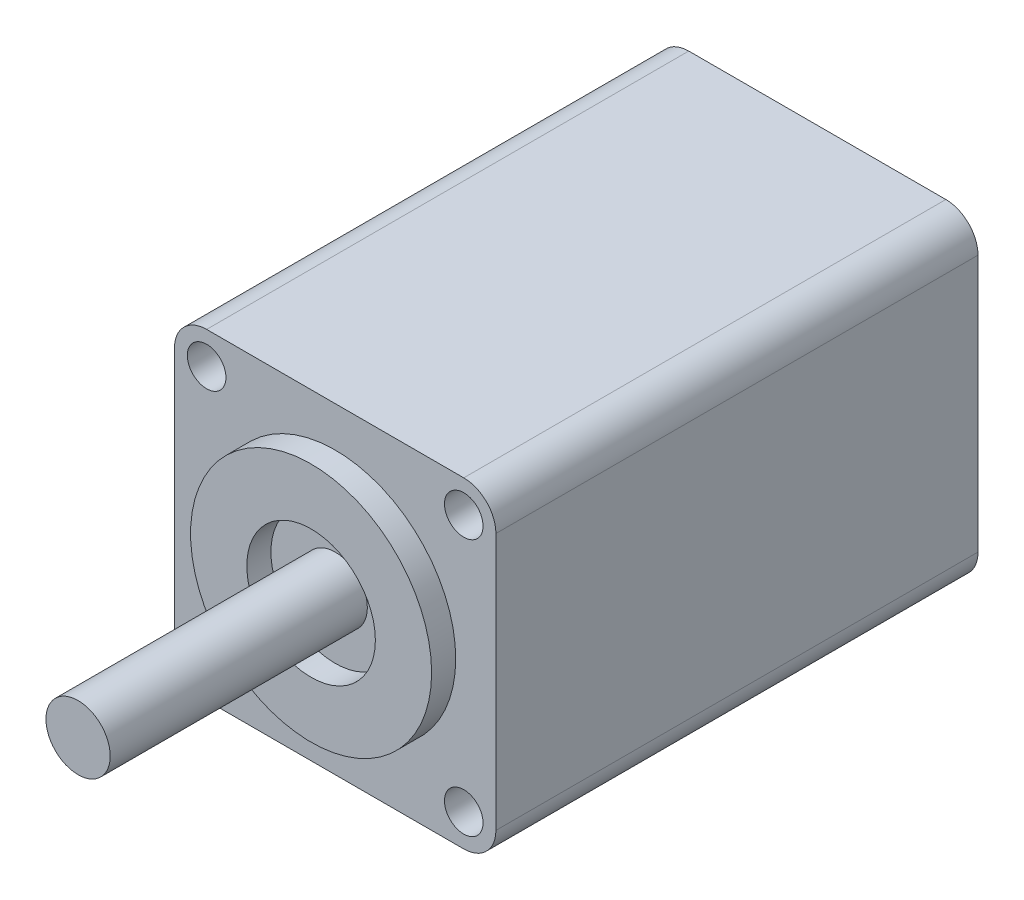
ISO-10303-21;
HEADER;
FILE_DESCRIPTION(('STEP AP214'),'2;1');
FILE_NAME('part.step','',(''),(''),'','','');
FILE_SCHEMA(('AUTOMOTIVE_DESIGN { 1 0 10303 214 1 1 1 1 }'));
ENDSEC;
DATA;
#1=APPLICATION_CONTEXT('core data for automotive mechanical design processes');
#2=APPLICATION_PROTOCOL_DEFINITION('international standard','automotive_design',2000,#1);
#3=PRODUCT_CONTEXT('',#1,'mechanical');
#4=PRODUCT('Part','Part','',(#3));
#5=PRODUCT_RELATED_PRODUCT_CATEGORY('part','',(#4));
#6=PRODUCT_DEFINITION_FORMATION('','',#4);
#7=PRODUCT_DEFINITION_CONTEXT('part definition',#1,'design');
#8=PRODUCT_DEFINITION('design','',#6,#7);
#9=PRODUCT_DEFINITION_SHAPE('','',#8);
#10=(LENGTH_UNIT() NAMED_UNIT(*) SI_UNIT(.MILLI.,.METRE.));
#11=(NAMED_UNIT(*) PLANE_ANGLE_UNIT() SI_UNIT($,.RADIAN.));
#12=(NAMED_UNIT(*) SI_UNIT($,.STERADIAN.) SOLID_ANGLE_UNIT());
#13=UNCERTAINTY_MEASURE_WITH_UNIT(LENGTH_MEASURE(1.E-05),#10,'distance_accuracy_value','');
#14=(GEOMETRIC_REPRESENTATION_CONTEXT(3) GLOBAL_UNCERTAINTY_ASSIGNED_CONTEXT((#13)) GLOBAL_UNIT_ASSIGNED_CONTEXT((#10,
#11,#12)) REPRESENTATION_CONTEXT('',''));
#15=CARTESIAN_POINT('',(0.,0.,0.));
#16=DIRECTION('',(0.,0.,1.));
#17=DIRECTION('',(1.,0.,0.));
#18=AXIS2_PLACEMENT_3D('',#15,#16,#17);
#19=CARTESIAN_POINT('',(-8.,-8.00000000000001,0.));
#20=DIRECTION('',(0.,0.,1.));
#21=DIRECTION('',(1.,0.,0.));
#22=AXIS2_PLACEMENT_3D('',#19,#20,#21);
#23=PLANE('',#22);
#24=CARTESIAN_POINT('',(0.,0.,0.));
#25=DIRECTION('',(0.,0.,1.));
#26=DIRECTION('',(1.,0.,0.));
#27=AXIS2_PLACEMENT_3D('',#24,#25,#26);
#28=CIRCLE('',#27,4.);
#29=CARTESIAN_POINT('',(4.,0.,0.));
#30=VERTEX_POINT('',#29);
#31=EDGE_CURVE('E11',#30,#30,#28,.F.);
#32=ORIENTED_EDGE('',*,*,#31,.F.);
#33=EDGE_LOOP('',(#32));
#34=FACE_BOUND('',#33,.T.);
#35=CARTESIAN_POINT('',(0.,0.,0.));
#36=DIRECTION('',(0.,0.,1.));
#37=DIRECTION('',(1.,0.,0.));
#38=AXIS2_PLACEMENT_3D('',#35,#36,#37);
#39=CIRCLE('',#38,2.);
#40=CARTESIAN_POINT('',(2.,0.,0.));
#41=VERTEX_POINT('',#40);
#42=EDGE_CURVE('E271',#41,#41,#39,.T.);
#43=ORIENTED_EDGE('',*,*,#42,.F.);
#44=EDGE_LOOP('',(#43));
#45=FACE_BOUND('',#44,.T.);
#46=ADVANCED_FACE('F32',(#34,#45),#23,.T.);
#47=CARTESIAN_POINT('',(-8.,8.,0.));
#48=DIRECTION('',(0.,0.,1.));
#49=DIRECTION('',(1.,0.,0.));
#50=AXIS2_PLACEMENT_3D('',#47,#48,#49);
#51=CIRCLE('',#50,1.2);
#52=CARTESIAN_POINT('',(-6.8,8.,0.));
#53=VERTEX_POINT('',#52);
#54=EDGE_CURVE('E249',#53,#53,#51,.T.);
#55=ORIENTED_EDGE('',*,*,#54,.F.);
#56=EDGE_LOOP('',(#55));
#57=FACE_BOUND('',#56,.T.);
#58=CARTESIAN_POINT('',(8.,8.,0.));
#59=DIRECTION('',(0.,0.,1.));
#60=DIRECTION('',(1.,0.,0.));
#61=AXIS2_PLACEMENT_3D('',#58,#59,#60);
#62=CIRCLE('',#61,1.2);
#63=CARTESIAN_POINT('',(9.2,8.,0.));
#64=VERTEX_POINT('',#63);
#65=EDGE_CURVE('E251',#64,#64,#62,.T.);
#66=ORIENTED_EDGE('',*,*,#65,.F.);
#67=EDGE_LOOP('',(#66));
#68=FACE_BOUND('',#67,.T.);
#69=CARTESIAN_POINT('',(8.,-8.,0.));
#70=DIRECTION('',(0.,0.,1.));
#71=DIRECTION('',(1.,0.,0.));
#72=AXIS2_PLACEMENT_3D('',#69,#70,#71);
#73=CIRCLE('',#72,1.2);
#74=CARTESIAN_POINT('',(9.2,-8.,0.));
#75=VERTEX_POINT('',#74);
#76=EDGE_CURVE('E259',#75,#75,#73,.T.);
#77=ORIENTED_EDGE('',*,*,#76,.F.);
#78=EDGE_LOOP('',(#77));
#79=FACE_BOUND('',#78,.T.);
#80=CARTESIAN_POINT('',(-8.,-8.,0.));
#81=DIRECTION('',(0.,0.,1.));
#82=DIRECTION('',(1.,0.,0.));
#83=AXIS2_PLACEMENT_3D('',#80,#81,#82);
#84=CIRCLE('',#83,1.2);
#85=CARTESIAN_POINT('',(-6.8,-8.,0.));
#86=VERTEX_POINT('',#85);
#87=EDGE_CURVE('E265',#86,#86,#84,.T.);
#88=ORIENTED_EDGE('',*,*,#87,.F.);
#89=EDGE_LOOP('',(#88));
#90=FACE_BOUND('',#89,.T.);
#91=CARTESIAN_POINT('',(-8.,-8.00000000000001,0.));
#92=DIRECTION('',(0.,0.,1.));
#93=DIRECTION('',(1.,0.,0.));
#94=AXIS2_PLACEMENT_3D('',#91,#92,#93);
#95=CIRCLE('',#94,2.);
#96=CARTESIAN_POINT('',(-10.,-8.00000000000001,0.));
#97=VERTEX_POINT('',#96);
#98=CARTESIAN_POINT('',(-8.,-10.,0.));
#99=VERTEX_POINT('',#98);
#100=EDGE_CURVE('E134',#97,#99,#95,.T.);
#101=ORIENTED_EDGE('',*,*,#100,.T.);
#102=DIRECTION('',(1.,0.,0.));
#103=VECTOR('',#102,1.);
#104=CARTESIAN_POINT('',(-8.,-10.,0.));
#105=LINE('',#104,#103);
#106=CARTESIAN_POINT('',(8.,-10.,0.));
#107=VERTEX_POINT('',#106);
#108=EDGE_CURVE('E137',#99,#107,#105,.T.);
#109=ORIENTED_EDGE('',*,*,#108,.T.);
#110=CARTESIAN_POINT('',(8.,-8.00000000000001,0.));
#111=DIRECTION('',(0.,0.,1.));
#112=DIRECTION('',(1.,0.,0.));
#113=AXIS2_PLACEMENT_3D('',#110,#111,#112);
#114=CIRCLE('',#113,2.);
#115=CARTESIAN_POINT('',(10.,-8.00000000000001,0.));
#116=VERTEX_POINT('',#115);
#117=EDGE_CURVE('E141',#107,#116,#114,.T.);
#118=ORIENTED_EDGE('',*,*,#117,.T.);
#119=DIRECTION('',(0.,1.,0.));
#120=VECTOR('',#119,1.);
#121=CARTESIAN_POINT('',(10.,-8.00000000000001,0.));
#122=LINE('',#121,#120);
#123=CARTESIAN_POINT('',(10.,7.99999999999999,0.));
#124=VERTEX_POINT('',#123);
#125=EDGE_CURVE('E144',#116,#124,#122,.T.);
#126=ORIENTED_EDGE('',*,*,#125,.T.);
#127=CARTESIAN_POINT('',(8.,7.99999999999999,0.));
#128=DIRECTION('',(0.,0.,1.));
#129=DIRECTION('',(-1.,0.,0.));
#130=AXIS2_PLACEMENT_3D('',#127,#128,#129);
#131=CIRCLE('',#130,2.);
#132=CARTESIAN_POINT('',(8.,9.99999999999999,0.));
#133=VERTEX_POINT('',#132);
#134=EDGE_CURVE('E147',#124,#133,#131,.T.);
#135=ORIENTED_EDGE('',*,*,#134,.T.);
#136=DIRECTION('',(-1.,0.,0.));
#137=VECTOR('',#136,1.);
#138=CARTESIAN_POINT('',(-8.,9.99999999999999,0.));
#139=LINE('',#138,#137);
#140=CARTESIAN_POINT('',(-8.,9.99999999999999,0.));
#141=VERTEX_POINT('',#140);
#142=EDGE_CURVE('E150',#133,#141,#139,.T.);
#143=ORIENTED_EDGE('',*,*,#142,.T.);
#144=CARTESIAN_POINT('',(-8.,7.99999999999999,0.));
#145=DIRECTION('',(0.,0.,1.));
#146=DIRECTION('',(1.,0.,0.));
#147=AXIS2_PLACEMENT_3D('',#144,#145,#146);
#148=CIRCLE('',#147,2.);
#149=CARTESIAN_POINT('',(-10.,7.99999999999999,0.));
#150=VERTEX_POINT('',#149);
#151=EDGE_CURVE('E111',#141,#150,#148,.T.);
#152=ORIENTED_EDGE('',*,*,#151,.T.);
#153=DIRECTION('',(0.,-1.,0.));
#154=VECTOR('',#153,1.);
#155=CARTESIAN_POINT('',(-10.,-8.00000000000001,0.));
#156=LINE('',#155,#154);
#157=EDGE_CURVE('E153',#150,#97,#156,.T.);
#158=ORIENTED_EDGE('',*,*,#157,.T.);
#159=EDGE_LOOP('',(#101,#109,#118,#126,#135,#143,#152,#158));
#160=FACE_BOUND('',#159,.T.);
#161=CARTESIAN_POINT('',(0.,0.,0.));
#162=DIRECTION('',(0.,0.,1.));
#163=DIRECTION('',(1.,0.,0.));
#164=AXIS2_PLACEMENT_3D('',#161,#162,#163);
#165=CIRCLE('',#164,7.5);
#166=CARTESIAN_POINT('',(7.5,0.,0.));
#167=VERTEX_POINT('',#166);
#168=EDGE_CURVE('E280',#167,#167,#165,.T.);
#169=ORIENTED_EDGE('',*,*,#168,.F.);
#170=EDGE_LOOP('',(#169));
#171=FACE_BOUND('',#170,.T.);
#172=ADVANCED_FACE('F168',(#57,#68,#79,#90,#160,#171),#23,.T.);
#173=CARTESIAN_POINT('',(-8.,-8.00000000000001,-30.));
#174=DIRECTION('',(0.,0.,1.));
#175=DIRECTION('',(1.,0.,0.));
#176=AXIS2_PLACEMENT_3D('',#173,#174,#175);
#177=CYLINDRICAL_SURFACE('',#176,2.);
#178=ORIENTED_EDGE('',*,*,#100,.F.);
#179=DIRECTION('',(0.,0.,1.));
#180=VECTOR('',#179,1.);
#181=CARTESIAN_POINT('',(-10.,-8.00000000000001,-30.));
#182=LINE('',#181,#180);
#183=CARTESIAN_POINT('',(-10.,-8.00000000000001,-30.));
#184=VERTEX_POINT('',#183);
#185=EDGE_CURVE('E41',#184,#97,#182,.T.);
#186=ORIENTED_EDGE('',*,*,#185,.F.);
#187=CARTESIAN_POINT('',(-8.,-8.00000000000001,-30.));
#188=DIRECTION('',(0.,0.,1.));
#189=DIRECTION('',(1.,0.,0.));
#190=AXIS2_PLACEMENT_3D('',#187,#188,#189);
#191=CIRCLE('',#190,2.);
#192=CARTESIAN_POINT('',(-8.,-10.,-30.));
#193=VERTEX_POINT('',#192);
#194=EDGE_CURVE('E156',#184,#193,#191,.T.);
#195=ORIENTED_EDGE('',*,*,#194,.T.);
#196=DIRECTION('',(0.,0.,1.));
#197=VECTOR('',#196,1.);
#198=CARTESIAN_POINT('',(-8.,-10.,-30.));
#199=LINE('',#198,#197);
#200=EDGE_CURVE('E90',#193,#99,#199,.T.);
#201=ORIENTED_EDGE('',*,*,#200,.T.);
#202=EDGE_LOOP('',(#178,#186,#195,#201));
#203=FACE_BOUND('',#202,.T.);
#204=ADVANCED_FACE('F34',(#203),#177,.T.);
#205=CARTESIAN_POINT('',(-10.,-8.00000000000001,-30.));
#206=DIRECTION('',(-1.,0.,0.));
#207=DIRECTION('',(0.,0.,1.));
#208=AXIS2_PLACEMENT_3D('',#205,#206,#207);
#209=PLANE('',#208);
#210=ORIENTED_EDGE('',*,*,#157,.F.);
#211=DIRECTION('',(0.,0.,1.));
#212=VECTOR('',#211,1.);
#213=CARTESIAN_POINT('',(-10.,7.99999999999999,-30.));
#214=LINE('',#213,#212);
#215=CARTESIAN_POINT('',(-10.,7.99999999999999,-30.));
#216=VERTEX_POINT('',#215);
#217=EDGE_CURVE('E78',#216,#150,#214,.T.);
#218=ORIENTED_EDGE('',*,*,#217,.F.);
#219=DIRECTION('',(0.,-1.,0.));
#220=VECTOR('',#219,1.);
#221=CARTESIAN_POINT('',(-10.,-8.00000000000001,-30.));
#222=LINE('',#221,#220);
#223=EDGE_CURVE('E124',#216,#184,#222,.T.);
#224=ORIENTED_EDGE('',*,*,#223,.T.);
#225=ORIENTED_EDGE('',*,*,#185,.T.);
#226=EDGE_LOOP('',(#210,#218,#224,#225));
#227=FACE_BOUND('',#226,.T.);
#228=ADVANCED_FACE('F170',(#227),#209,.T.);
#229=CARTESIAN_POINT('',(-8.,7.99999999999999,-30.));
#230=DIRECTION('',(0.,0.,1.));
#231=DIRECTION('',(1.,0.,0.));
#232=AXIS2_PLACEMENT_3D('',#229,#230,#231);
#233=CYLINDRICAL_SURFACE('',#232,2.);
#234=ORIENTED_EDGE('',*,*,#151,.F.);
#235=DIRECTION('',(0.,0.,1.));
#236=VECTOR('',#235,1.);
#237=CARTESIAN_POINT('',(-8.,9.99999999999999,-30.));
#238=LINE('',#237,#236);
#239=CARTESIAN_POINT('',(-8.,9.99999999999999,-30.));
#240=VERTEX_POINT('',#239);
#241=EDGE_CURVE('E106',#240,#141,#238,.T.);
#242=ORIENTED_EDGE('',*,*,#241,.F.);
#243=CARTESIAN_POINT('',(-8.,7.99999999999999,-30.));
#244=DIRECTION('',(0.,0.,1.));
#245=DIRECTION('',(1.,0.,0.));
#246=AXIS2_PLACEMENT_3D('',#243,#244,#245);
#247=CIRCLE('',#246,2.);
#248=EDGE_CURVE('E109',#240,#216,#247,.T.);
#249=ORIENTED_EDGE('',*,*,#248,.T.);
#250=ORIENTED_EDGE('',*,*,#217,.T.);
#251=EDGE_LOOP('',(#234,#242,#249,#250));
#252=FACE_BOUND('',#251,.T.);
#253=ADVANCED_FACE('F108',(#252),#233,.T.);
#254=CARTESIAN_POINT('',(-8.,9.99999999999999,-30.));
#255=DIRECTION('',(0.,1.,0.));
#256=DIRECTION('',(0.,0.,1.));
#257=AXIS2_PLACEMENT_3D('',#254,#255,#256);
#258=PLANE('',#257);
#259=ORIENTED_EDGE('',*,*,#142,.F.);
#260=DIRECTION('',(0.,0.,1.));
#261=VECTOR('',#260,1.);
#262=CARTESIAN_POINT('',(8.,9.99999999999999,-30.));
#263=LINE('',#262,#261);
#264=CARTESIAN_POINT('',(8.,9.99999999999999,-30.));
#265=VERTEX_POINT('',#264);
#266=EDGE_CURVE('E116',#265,#133,#263,.T.);
#267=ORIENTED_EDGE('',*,*,#266,.F.);
#268=DIRECTION('',(-1.,0.,0.));
#269=VECTOR('',#268,1.);
#270=CARTESIAN_POINT('',(-8.,9.99999999999999,-30.));
#271=LINE('',#270,#269);
#272=EDGE_CURVE('E122',#265,#240,#271,.T.);
#273=ORIENTED_EDGE('',*,*,#272,.T.);
#274=ORIENTED_EDGE('',*,*,#241,.T.);
#275=EDGE_LOOP('',(#259,#267,#273,#274));
#276=FACE_BOUND('',#275,.T.);
#277=ADVANCED_FACE('F126',(#276),#258,.T.);
#278=CARTESIAN_POINT('',(8.,7.99999999999999,-30.));
#279=DIRECTION('',(0.,0.,1.));
#280=DIRECTION('',(1.,0.,0.));
#281=AXIS2_PLACEMENT_3D('',#278,#279,#280);
#282=CYLINDRICAL_SURFACE('',#281,2.);
#283=ORIENTED_EDGE('',*,*,#134,.F.);
#284=DIRECTION('',(0.,0.,1.));
#285=VECTOR('',#284,1.);
#286=CARTESIAN_POINT('',(10.,7.99999999999999,-30.));
#287=LINE('',#286,#285);
#288=CARTESIAN_POINT('',(10.,7.99999999999999,-30.));
#289=VERTEX_POINT('',#288);
#290=EDGE_CURVE('E160',#289,#124,#287,.T.);
#291=ORIENTED_EDGE('',*,*,#290,.F.);
#292=CARTESIAN_POINT('',(8.,7.99999999999999,-30.));
#293=DIRECTION('',(0.,0.,1.));
#294=DIRECTION('',(-1.,0.,0.));
#295=AXIS2_PLACEMENT_3D('',#292,#293,#294);
#296=CIRCLE('',#295,2.);
#297=EDGE_CURVE('E127',#289,#265,#296,.T.);
#298=ORIENTED_EDGE('',*,*,#297,.T.);
#299=ORIENTED_EDGE('',*,*,#266,.T.);
#300=EDGE_LOOP('',(#283,#291,#298,#299));
#301=FACE_BOUND('',#300,.T.);
#302=ADVANCED_FACE('F300',(#301),#282,.T.);
#303=CARTESIAN_POINT('',(10.,-8.00000000000001,-30.));
#304=DIRECTION('',(1.,0.,0.));
#305=DIRECTION('',(0.,0.,-1.));
#306=AXIS2_PLACEMENT_3D('',#303,#304,#305);
#307=PLANE('',#306);
#308=ORIENTED_EDGE('',*,*,#125,.F.);
#309=DIRECTION('',(0.,0.,1.));
#310=VECTOR('',#309,1.);
#311=CARTESIAN_POINT('',(10.,-8.00000000000001,-30.));
#312=LINE('',#311,#310);
#313=CARTESIAN_POINT('',(10.,-8.00000000000001,-30.));
#314=VERTEX_POINT('',#313);
#315=EDGE_CURVE('E162',#314,#116,#312,.T.);
#316=ORIENTED_EDGE('',*,*,#315,.F.);
#317=DIRECTION('',(0.,1.,0.));
#318=VECTOR('',#317,1.);
#319=CARTESIAN_POINT('',(10.,-8.00000000000001,-30.));
#320=LINE('',#319,#318);
#321=EDGE_CURVE('E129',#314,#289,#320,.T.);
#322=ORIENTED_EDGE('',*,*,#321,.T.);
#323=ORIENTED_EDGE('',*,*,#290,.T.);
#324=EDGE_LOOP('',(#308,#316,#322,#323));
#325=FACE_BOUND('',#324,.T.);
#326=ADVANCED_FACE('F294',(#325),#307,.T.);
#327=CARTESIAN_POINT('',(8.,-8.00000000000001,-30.));
#328=DIRECTION('',(0.,0.,1.));
#329=DIRECTION('',(1.,0.,0.));
#330=AXIS2_PLACEMENT_3D('',#327,#328,#329);
#331=CYLINDRICAL_SURFACE('',#330,2.);
#332=ORIENTED_EDGE('',*,*,#117,.F.);
#333=DIRECTION('',(0.,0.,1.));
#334=VECTOR('',#333,1.);
#335=CARTESIAN_POINT('',(8.,-10.,-30.));
#336=LINE('',#335,#334);
#337=CARTESIAN_POINT('',(8.,-10.,-30.));
#338=VERTEX_POINT('',#337);
#339=EDGE_CURVE('E164',#338,#107,#336,.T.);
#340=ORIENTED_EDGE('',*,*,#339,.F.);
#341=CARTESIAN_POINT('',(8.,-8.00000000000001,-30.));
#342=DIRECTION('',(0.,0.,1.));
#343=DIRECTION('',(1.,0.,0.));
#344=AXIS2_PLACEMENT_3D('',#341,#342,#343);
#345=CIRCLE('',#344,2.);
#346=EDGE_CURVE('E288',#338,#314,#345,.T.);
#347=ORIENTED_EDGE('',*,*,#346,.T.);
#348=ORIENTED_EDGE('',*,*,#315,.T.);
#349=EDGE_LOOP('',(#332,#340,#347,#348));
#350=FACE_BOUND('',#349,.T.);
#351=ADVANCED_FACE('F298',(#350),#331,.T.);
#352=CARTESIAN_POINT('',(-8.,-10.,-30.));
#353=DIRECTION('',(0.,-1.,0.));
#354=DIRECTION('',(0.,0.,-1.));
#355=AXIS2_PLACEMENT_3D('',#352,#353,#354);
#356=PLANE('',#355);
#357=ORIENTED_EDGE('',*,*,#108,.F.);
#358=ORIENTED_EDGE('',*,*,#200,.F.);
#359=DIRECTION('',(1.,0.,0.));
#360=VECTOR('',#359,1.);
#361=CARTESIAN_POINT('',(-8.,-10.,-30.));
#362=LINE('',#361,#360);
#363=EDGE_CURVE('E286',#193,#338,#362,.T.);
#364=ORIENTED_EDGE('',*,*,#363,.T.);
#365=ORIENTED_EDGE('',*,*,#339,.T.);
#366=EDGE_LOOP('',(#357,#358,#364,#365));
#367=FACE_BOUND('',#366,.T.);
#368=ADVANCED_FACE('F165',(#367),#356,.T.);
#369=CARTESIAN_POINT('',(-8.,-8.00000000000001,-30.));
#370=DIRECTION('',(0.,0.,1.));
#371=DIRECTION('',(1.,0.,0.));
#372=AXIS2_PLACEMENT_3D('',#369,#370,#371);
#373=PLANE('',#372);
#374=ORIENTED_EDGE('',*,*,#194,.F.);
#375=ORIENTED_EDGE('',*,*,#223,.F.);
#376=ORIENTED_EDGE('',*,*,#248,.F.);
#377=ORIENTED_EDGE('',*,*,#272,.F.);
#378=ORIENTED_EDGE('',*,*,#297,.F.);
#379=ORIENTED_EDGE('',*,*,#321,.F.);
#380=ORIENTED_EDGE('',*,*,#346,.F.);
#381=ORIENTED_EDGE('',*,*,#363,.F.);
#382=EDGE_LOOP('',(#374,#375,#376,#377,#378,#379,#380,#381));
#383=FACE_BOUND('',#382,.T.);
#384=ADVANCED_FACE('F120',(#383),#373,.F.);
#385=CARTESIAN_POINT('',(0.,0.,1.5));
#386=DIRECTION('',(0.,0.,1.));
#387=DIRECTION('',(1.,0.,0.));
#388=AXIS2_PLACEMENT_3D('',#385,#386,#387);
#389=PLANE('',#388);
#390=CARTESIAN_POINT('',(0.,0.,1.5));
#391=DIRECTION('',(0.,0.,1.));
#392=DIRECTION('',(1.,0.,0.));
#393=AXIS2_PLACEMENT_3D('',#390,#391,#392);
#394=CIRCLE('',#393,7.5);
#395=CARTESIAN_POINT('',(7.5,0.,1.5));
#396=VERTEX_POINT('',#395);
#397=EDGE_CURVE('E138',#396,#396,#394,.T.);
#398=ORIENTED_EDGE('',*,*,#397,.T.);
#399=EDGE_LOOP('',(#398));
#400=FACE_BOUND('',#399,.T.);
#401=CARTESIAN_POINT('',(0.,0.,1.5));
#402=DIRECTION('',(0.,0.,1.));
#403=DIRECTION('',(1.,0.,0.));
#404=AXIS2_PLACEMENT_3D('',#401,#402,#403);
#405=CIRCLE('',#404,4.);
#406=CARTESIAN_POINT('',(4.,0.,1.5));
#407=VERTEX_POINT('',#406);
#408=EDGE_CURVE('E275',#407,#407,#405,.T.);
#409=ORIENTED_EDGE('',*,*,#408,.F.);
#410=EDGE_LOOP('',(#409));
#411=FACE_BOUND('',#410,.T.);
#412=ADVANCED_FACE('F190',(#400,#411),#389,.T.);
#413=CARTESIAN_POINT('',(0.,0.,1.5));
#414=DIRECTION('',(0.,0.,-1.));
#415=DIRECTION('',(-1.,0.,0.));
#416=AXIS2_PLACEMENT_3D('',#413,#414,#415);
#417=CYLINDRICAL_SURFACE('',#416,7.5);
#418=ORIENTED_EDGE('',*,*,#397,.F.);
#419=EDGE_LOOP('',(#418));
#420=FACE_BOUND('',#419,.T.);
#421=ORIENTED_EDGE('',*,*,#168,.T.);
#422=EDGE_LOOP('',(#421));
#423=FACE_BOUND('',#422,.T.);
#424=ADVANCED_FACE('F191',(#420,#423),#417,.T.);
#425=CARTESIAN_POINT('',(0.,0.,1.5));
#426=DIRECTION('',(0.,0.,-1.));
#427=DIRECTION('',(-1.,0.,0.));
#428=AXIS2_PLACEMENT_3D('',#425,#426,#427);
#429=CYLINDRICAL_SURFACE('',#428,4.);
#430=ORIENTED_EDGE('',*,*,#408,.T.);
#431=EDGE_LOOP('',(#430));
#432=FACE_BOUND('',#431,.T.);
#433=ORIENTED_EDGE('',*,*,#31,.T.);
#434=EDGE_LOOP('',(#433));
#435=FACE_BOUND('',#434,.T.);
#436=ADVANCED_FACE('F194',(#432,#435),#429,.F.);
#437=CARTESIAN_POINT('',(0.,0.,16.));
#438=DIRECTION('',(0.,0.,-1.));
#439=DIRECTION('',(-1.,0.,0.));
#440=AXIS2_PLACEMENT_3D('',#437,#438,#439);
#441=CYLINDRICAL_SURFACE('',#440,2.);
#442=CARTESIAN_POINT('',(0.,0.,16.));
#443=DIRECTION('',(0.,0.,1.));
#444=DIRECTION('',(1.,0.,0.));
#445=AXIS2_PLACEMENT_3D('',#442,#443,#444);
#446=CIRCLE('',#445,2.);
#447=CARTESIAN_POINT('',(2.,0.,16.));
#448=VERTEX_POINT('',#447);
#449=EDGE_CURVE('E272',#448,#448,#446,.T.);
#450=ORIENTED_EDGE('',*,*,#449,.F.);
#451=EDGE_LOOP('',(#450));
#452=FACE_BOUND('',#451,.T.);
#453=ORIENTED_EDGE('',*,*,#42,.T.);
#454=EDGE_LOOP('',(#453));
#455=FACE_BOUND('',#454,.T.);
#456=ADVANCED_FACE('F201',(#452,#455),#441,.T.);
#457=CARTESIAN_POINT('',(0.,0.,16.));
#458=DIRECTION('',(0.,0.,1.));
#459=DIRECTION('',(1.,0.,0.));
#460=AXIS2_PLACEMENT_3D('',#457,#458,#459);
#461=PLANE('',#460);
#462=ORIENTED_EDGE('',*,*,#449,.T.);
#463=EDGE_LOOP('',(#462));
#464=FACE_BOUND('',#463,.T.);
#465=ADVANCED_FACE('F205',(#464),#461,.T.);
#466=CARTESIAN_POINT('',(-8.,-8.,-3.5));
#467=DIRECTION('',(0.,0.,1.));
#468=DIRECTION('',(1.,0.,0.));
#469=AXIS2_PLACEMENT_3D('',#466,#467,#468);
#470=CONICAL_SURFACE('',#469,1.2,1.02974425867665);
#471=CARTESIAN_POINT('',(-8.,-8.,-4.22103274283307));
#472=VERTEX_POINT('',#471);
#473=VERTEX_LOOP('',#472);
#474=FACE_BOUND('',#473,.T.);
#475=CARTESIAN_POINT('',(-8.,-8.,-3.5));
#476=DIRECTION('',(0.,0.,1.));
#477=DIRECTION('',(1.,0.,0.));
#478=AXIS2_PLACEMENT_3D('',#475,#476,#477);
#479=CIRCLE('',#478,1.2);
#480=CARTESIAN_POINT('',(-6.8,-8.,-3.5));
#481=VERTEX_POINT('',#480);
#482=EDGE_CURVE('E268',#481,#481,#479,.T.);
#483=ORIENTED_EDGE('',*,*,#482,.T.);
#484=EDGE_LOOP('',(#483));
#485=FACE_BOUND('',#484,.T.);
#486=ADVANCED_FACE('F209',(#474,#485),#470,.F.);
#487=CARTESIAN_POINT('',(-8.,-8.,0.));
#488=DIRECTION('',(0.,0.,1.));
#489=DIRECTION('',(1.,0.,0.));
#490=AXIS2_PLACEMENT_3D('',#487,#488,#489);
#491=CYLINDRICAL_SURFACE('',#490,1.2);
#492=ORIENTED_EDGE('',*,*,#482,.F.);
#493=EDGE_LOOP('',(#492));
#494=FACE_BOUND('',#493,.T.);
#495=ORIENTED_EDGE('',*,*,#87,.T.);
#496=EDGE_LOOP('',(#495));
#497=FACE_BOUND('',#496,.T.);
#498=ADVANCED_FACE('F213',(#494,#497),#491,.F.);
#499=CARTESIAN_POINT('',(8.,-8.,-3.5));
#500=DIRECTION('',(0.,0.,1.));
#501=DIRECTION('',(1.,0.,0.));
#502=AXIS2_PLACEMENT_3D('',#499,#500,#501);
#503=CONICAL_SURFACE('',#502,1.2,1.02974425867665);
#504=CARTESIAN_POINT('',(8.,-8.,-4.22103274283307));
#505=VERTEX_POINT('',#504);
#506=VERTEX_LOOP('',#505);
#507=FACE_BOUND('',#506,.T.);
#508=CARTESIAN_POINT('',(8.,-8.,-3.5));
#509=DIRECTION('',(0.,0.,1.));
#510=DIRECTION('',(1.,0.,0.));
#511=AXIS2_PLACEMENT_3D('',#508,#509,#510);
#512=CIRCLE('',#511,1.2);
#513=CARTESIAN_POINT('',(9.2,-8.,-3.5));
#514=VERTEX_POINT('',#513);
#515=EDGE_CURVE('E262',#514,#514,#512,.T.);
#516=ORIENTED_EDGE('',*,*,#515,.T.);
#517=EDGE_LOOP('',(#516));
#518=FACE_BOUND('',#517,.T.);
#519=ADVANCED_FACE('F217',(#507,#518),#503,.F.);
#520=CARTESIAN_POINT('',(8.,-8.,0.));
#521=DIRECTION('',(0.,0.,1.));
#522=DIRECTION('',(1.,0.,0.));
#523=AXIS2_PLACEMENT_3D('',#520,#521,#522);
#524=CYLINDRICAL_SURFACE('',#523,1.2);
#525=ORIENTED_EDGE('',*,*,#515,.F.);
#526=EDGE_LOOP('',(#525));
#527=FACE_BOUND('',#526,.T.);
#528=ORIENTED_EDGE('',*,*,#76,.T.);
#529=EDGE_LOOP('',(#528));
#530=FACE_BOUND('',#529,.T.);
#531=ADVANCED_FACE('F221',(#527,#530),#524,.F.);
#532=CARTESIAN_POINT('',(8.,8.,-3.5));
#533=DIRECTION('',(0.,0.,1.));
#534=DIRECTION('',(1.,0.,0.));
#535=AXIS2_PLACEMENT_3D('',#532,#533,#534);
#536=CONICAL_SURFACE('',#535,1.2,1.02974425867665);
#537=CARTESIAN_POINT('',(8.,8.,-4.22103274283307));
#538=VERTEX_POINT('',#537);
#539=VERTEX_LOOP('',#538);
#540=FACE_BOUND('',#539,.T.);
#541=CARTESIAN_POINT('',(8.,8.,-3.5));
#542=DIRECTION('',(0.,0.,1.));
#543=DIRECTION('',(1.,0.,0.));
#544=AXIS2_PLACEMENT_3D('',#541,#542,#543);
#545=CIRCLE('',#544,1.2);
#546=CARTESIAN_POINT('',(9.2,8.,-3.5));
#547=VERTEX_POINT('',#546);
#548=EDGE_CURVE('E256',#547,#547,#545,.T.);
#549=ORIENTED_EDGE('',*,*,#548,.T.);
#550=EDGE_LOOP('',(#549));
#551=FACE_BOUND('',#550,.T.);
#552=ADVANCED_FACE('F225',(#540,#551),#536,.F.);
#553=CARTESIAN_POINT('',(8.,8.,0.));
#554=DIRECTION('',(0.,0.,1.));
#555=DIRECTION('',(1.,0.,0.));
#556=AXIS2_PLACEMENT_3D('',#553,#554,#555);
#557=CYLINDRICAL_SURFACE('',#556,1.2);
#558=ORIENTED_EDGE('',*,*,#548,.F.);
#559=EDGE_LOOP('',(#558));
#560=FACE_BOUND('',#559,.T.);
#561=ORIENTED_EDGE('',*,*,#65,.T.);
#562=EDGE_LOOP('',(#561));
#563=FACE_BOUND('',#562,.T.);
#564=ADVANCED_FACE('F229',(#560,#563),#557,.F.);
#565=CARTESIAN_POINT('',(-8.,8.,-3.5));
#566=DIRECTION('',(0.,0.,1.));
#567=DIRECTION('',(1.,0.,0.));
#568=AXIS2_PLACEMENT_3D('',#565,#566,#567);
#569=CONICAL_SURFACE('',#568,1.2,1.02974425867665);
#570=CARTESIAN_POINT('',(-8.,8.,-4.22103274283307));
#571=VERTEX_POINT('',#570);
#572=VERTEX_LOOP('',#571);
#573=FACE_BOUND('',#572,.T.);
#574=CARTESIAN_POINT('',(-8.,8.,-3.5));
#575=DIRECTION('',(0.,0.,1.));
#576=DIRECTION('',(1.,0.,0.));
#577=AXIS2_PLACEMENT_3D('',#574,#575,#576);
#578=CIRCLE('',#577,1.2);
#579=CARTESIAN_POINT('',(-6.8,8.,-3.5));
#580=VERTEX_POINT('',#579);
#581=EDGE_CURVE('E246',#580,#580,#578,.T.);
#582=ORIENTED_EDGE('',*,*,#581,.T.);
#583=EDGE_LOOP('',(#582));
#584=FACE_BOUND('',#583,.T.);
#585=ADVANCED_FACE('F233',(#573,#584),#569,.F.);
#586=CARTESIAN_POINT('',(-8.,8.,0.));
#587=DIRECTION('',(0.,0.,1.));
#588=DIRECTION('',(1.,0.,0.));
#589=AXIS2_PLACEMENT_3D('',#586,#587,#588);
#590=CYLINDRICAL_SURFACE('',#589,1.2);
#591=ORIENTED_EDGE('',*,*,#581,.F.);
#592=EDGE_LOOP('',(#591));
#593=FACE_BOUND('',#592,.T.);
#594=ORIENTED_EDGE('',*,*,#54,.T.);
#595=EDGE_LOOP('',(#594));
#596=FACE_BOUND('',#595,.T.);
#597=ADVANCED_FACE('F237',(#593,#596),#590,.F.);
#598=CLOSED_SHELL('',(#46,#172,#204,#228,#253,#277,#302,#326,#351,#368,#384,#412,#424,#436,#456,
#465,#486,#498,#519,#531,#552,#564,#585,#597));
#599=MANIFOLD_SOLID_BREP('B2',#598);
#600=ADVANCED_BREP_SHAPE_REPRESENTATION('',(#18,#599),#14);
#601=SHAPE_DEFINITION_REPRESENTATION(#9,#600);
ENDSEC;
END-ISO-10303-21;
